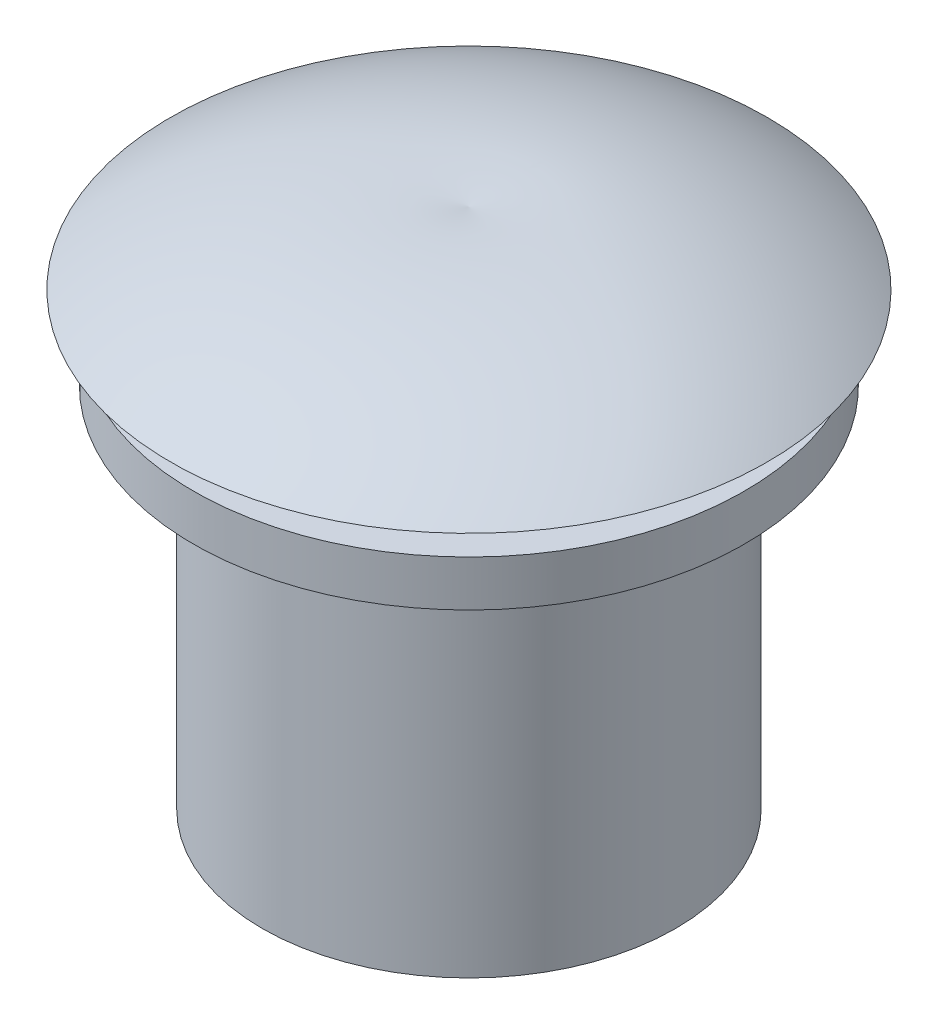
ISO-10303-21;
HEADER;
FILE_DESCRIPTION(('STEP AP214'),'2;1');
FILE_NAME('part.step','',(''),(''),'','','');
FILE_SCHEMA(('AUTOMOTIVE_DESIGN { 1 0 10303 214 1 1 1 1 }'));
ENDSEC;
DATA;
#1=APPLICATION_CONTEXT('core data for automotive mechanical design processes');
#2=APPLICATION_PROTOCOL_DEFINITION('international standard','automotive_design',2000,#1);
#3=PRODUCT_CONTEXT('',#1,'mechanical');
#4=PRODUCT('Part','Part','',(#3));
#5=PRODUCT_RELATED_PRODUCT_CATEGORY('part','',(#4));
#6=PRODUCT_DEFINITION_FORMATION('','',#4);
#7=PRODUCT_DEFINITION_CONTEXT('part definition',#1,'design');
#8=PRODUCT_DEFINITION('design','',#6,#7);
#9=PRODUCT_DEFINITION_SHAPE('','',#8);
#10=(LENGTH_UNIT() NAMED_UNIT(*) SI_UNIT(.MILLI.,.METRE.));
#11=(NAMED_UNIT(*) PLANE_ANGLE_UNIT() SI_UNIT($,.RADIAN.));
#12=(NAMED_UNIT(*) SI_UNIT($,.STERADIAN.) SOLID_ANGLE_UNIT());
#13=UNCERTAINTY_MEASURE_WITH_UNIT(LENGTH_MEASURE(1.E-05),#10,'distance_accuracy_value','');
#14=(GEOMETRIC_REPRESENTATION_CONTEXT(3) GLOBAL_UNCERTAINTY_ASSIGNED_CONTEXT((#13)) GLOBAL_UNIT_ASSIGNED_CONTEXT((#10,
#11,#12)) REPRESENTATION_CONTEXT('',''));
#15=CARTESIAN_POINT('',(0.,0.,0.));
#16=DIRECTION('',(0.,0.,1.));
#17=DIRECTION('',(1.,0.,0.));
#18=AXIS2_PLACEMENT_3D('',#15,#16,#17);
#19=CARTESIAN_POINT('',(0.,0.254030923392342,-0.150088243500463));
#20=DIRECTION('',(-1.,0.,0.));
#21=DIRECTION('',(0.,0.,-1.));
#22=AXIS2_PLACEMENT_3D('',#19,#20,#21);
#23=CIRCLE('',#22,1.19891957042545);
#24=TRIMMED_CURVE('',#23,(PARAMETER_VALUE(-1.69631188121676)),
(PARAMETER_VALUE(1.69631188121676)),.T.,.PARAMETER.);
#25=CARTESIAN_POINT('',(0.,0.254030923392342,0.));
#26=DIRECTION('',(0.,-1.,0.));
#27=AXIS1_PLACEMENT('',#25,#26);
#28=SURFACE_OF_REVOLUTION('',#24,#27);
#29=CARTESIAN_POINT('',(0.,1.44351890379067,0.));
#30=VERTEX_POINT('',#29);
#31=VERTEX_LOOP('',#30);
#32=FACE_BOUND('',#31,.T.);
#33=CARTESIAN_POINT('',(0.,1.2446,0.));
#34=DIRECTION('',(0.,-1.,0.));
#35=DIRECTION('',(0.,0.,-1.));
#36=AXIS2_PLACEMENT_3D('',#33,#34,#35);
#37=CIRCLE('',#36,0.825500000000002);
#38=CARTESIAN_POINT('',(0.,1.2446,-0.825500000000002));
#39=VERTEX_POINT('',#38);
#40=EDGE_CURVE('E11',#39,#39,#37,.T.);
#41=ORIENTED_EDGE('',*,*,#40,.F.);
#42=EDGE_LOOP('',(#41));
#43=FACE_BOUND('',#42,.T.);
#44=ADVANCED_FACE('F43',(#32,#43),#28,.T.);
#45=CARTESIAN_POINT('',(0.508000000000002,1.2446,0.));
#46=DIRECTION('',(0.,-1.,0.));
#47=DIRECTION('',(0.,0.,-1.));
#48=AXIS2_PLACEMENT_3D('',#45,#46,#47);
#49=PLANE('',#48);
#50=ORIENTED_EDGE('',*,*,#40,.T.);
#51=EDGE_LOOP('',(#50));
#52=FACE_BOUND('',#51,.T.);
#53=CARTESIAN_POINT('',(0.,1.2446,0.));
#54=DIRECTION('',(0.,-1.,0.));
#55=DIRECTION('',(0.,0.,-1.));
#56=AXIS2_PLACEMENT_3D('',#53,#54,#55);
#57=CIRCLE('',#56,0.508000000000002);
#58=CARTESIAN_POINT('',(0.,1.2446,-0.508000000000002));
#59=VERTEX_POINT('',#58);
#60=EDGE_CURVE('E50',#59,#59,#57,.T.);
#61=ORIENTED_EDGE('',*,*,#60,.F.);
#62=EDGE_LOOP('',(#61));
#63=FACE_BOUND('',#62,.T.);
#64=ADVANCED_FACE('F55',(#52,#63),#49,.T.);
#65=CARTESIAN_POINT('',(0.,0.,0.));
#66=DIRECTION('',(0.,-1.,0.));
#67=DIRECTION('',(0.,0.,-1.));
#68=AXIS2_PLACEMENT_3D('',#65,#66,#67);
#69=CYLINDRICAL_SURFACE('',#68,0.508000000000002);
#70=ORIENTED_EDGE('',*,*,#60,.T.);
#71=EDGE_LOOP('',(#70));
#72=FACE_BOUND('',#71,.T.);
#73=CARTESIAN_POINT('',(0.,1.143,0.));
#74=DIRECTION('',(0.,-1.,0.));
#75=DIRECTION('',(0.,0.,-1.));
#76=AXIS2_PLACEMENT_3D('',#73,#74,#75);
#77=CIRCLE('',#76,0.508000000000002);
#78=CARTESIAN_POINT('',(0.,1.143,-0.508000000000002));
#79=VERTEX_POINT('',#78);
#80=EDGE_CURVE('E65',#79,#79,#77,.T.);
#81=ORIENTED_EDGE('',*,*,#80,.F.);
#82=EDGE_LOOP('',(#81));
#83=FACE_BOUND('',#82,.T.);
#84=ADVANCED_FACE('F60',(#72,#83),#69,.T.);
#85=CARTESIAN_POINT('',(0.762000000000002,1.143,0.));
#86=DIRECTION('',(0.,1.,0.));
#87=DIRECTION('',(0.,0.,1.));
#88=AXIS2_PLACEMENT_3D('',#85,#86,#87);
#89=PLANE('',#88);
#90=ORIENTED_EDGE('',*,*,#80,.T.);
#91=EDGE_LOOP('',(#90));
#92=FACE_BOUND('',#91,.T.);
#93=CARTESIAN_POINT('',(0.,1.143,0.));
#94=DIRECTION('',(0.,-1.,0.));
#95=DIRECTION('',(0.,0.,-1.));
#96=AXIS2_PLACEMENT_3D('',#93,#94,#95);
#97=CIRCLE('',#96,0.762000000000002);
#98=CARTESIAN_POINT('',(0.,1.143,-0.762000000000002));
#99=VERTEX_POINT('',#98);
#100=EDGE_CURVE('E68',#99,#99,#97,.T.);
#101=ORIENTED_EDGE('',*,*,#100,.F.);
#102=EDGE_LOOP('',(#101));
#103=FACE_BOUND('',#102,.T.);
#104=ADVANCED_FACE('F137',(#92,#103),#89,.T.);
#105=CARTESIAN_POINT('',(0.,0.,0.));
#106=DIRECTION('',(0.,-1.,0.));
#107=DIRECTION('',(0.,0.,-1.));
#108=AXIS2_PLACEMENT_3D('',#105,#106,#107);
#109=CYLINDRICAL_SURFACE('',#108,0.762000000000002);
#110=ORIENTED_EDGE('',*,*,#100,.T.);
#111=EDGE_LOOP('',(#110));
#112=FACE_BOUND('',#111,.T.);
#113=CARTESIAN_POINT('',(0.,1.016,0.));
#114=DIRECTION('',(0.,-1.,0.));
#115=DIRECTION('',(0.,0.,-1.));
#116=AXIS2_PLACEMENT_3D('',#113,#114,#115);
#117=CIRCLE('',#116,0.762000000000002);
#118=CARTESIAN_POINT('',(0.,1.016,-0.762000000000002));
#119=VERTEX_POINT('',#118);
#120=EDGE_CURVE('E74',#119,#119,#117,.T.);
#121=ORIENTED_EDGE('',*,*,#120,.F.);
#122=EDGE_LOOP('',(#121));
#123=FACE_BOUND('',#122,.T.);
#124=ADVANCED_FACE('F133',(#112,#123),#109,.T.);
#125=CARTESIAN_POINT('',(0.5715,1.016,0.));
#126=DIRECTION('',(0.,-1.,0.));
#127=DIRECTION('',(0.,0.,-1.));
#128=AXIS2_PLACEMENT_3D('',#125,#126,#127);
#129=PLANE('',#128);
#130=ORIENTED_EDGE('',*,*,#120,.T.);
#131=EDGE_LOOP('',(#130));
#132=FACE_BOUND('',#131,.T.);
#133=CARTESIAN_POINT('',(0.,1.016,0.));
#134=DIRECTION('',(0.,-1.,0.));
#135=DIRECTION('',(0.,0.,-1.));
#136=AXIS2_PLACEMENT_3D('',#133,#134,#135);
#137=CIRCLE('',#136,0.5715);
#138=CARTESIAN_POINT('',(0.,1.016,-0.5715));
#139=VERTEX_POINT('',#138);
#140=EDGE_CURVE('E78',#139,#139,#137,.T.);
#141=ORIENTED_EDGE('',*,*,#140,.F.);
#142=EDGE_LOOP('',(#141));
#143=FACE_BOUND('',#142,.T.);
#144=ADVANCED_FACE('F129',(#132,#143),#129,.T.);
#145=CARTESIAN_POINT('',(0.,0.,0.));
#146=DIRECTION('',(0.,-1.,0.));
#147=DIRECTION('',(0.,0.,-1.));
#148=AXIS2_PLACEMENT_3D('',#145,#146,#147);
#149=CYLINDRICAL_SURFACE('',#148,0.5715);
#150=ORIENTED_EDGE('',*,*,#140,.T.);
#151=EDGE_LOOP('',(#150));
#152=FACE_BOUND('',#151,.T.);
#153=CARTESIAN_POINT('',(0.,0.,0.));
#154=DIRECTION('',(0.,-1.,0.));
#155=DIRECTION('',(0.,0.,-1.));
#156=AXIS2_PLACEMENT_3D('',#153,#154,#155);
#157=CIRCLE('',#156,0.5715);
#158=CARTESIAN_POINT('',(0.,0.,-0.5715));
#159=VERTEX_POINT('',#158);
#160=EDGE_CURVE('E82',#159,#159,#157,.T.);
#161=ORIENTED_EDGE('',*,*,#160,.F.);
#162=EDGE_LOOP('',(#161));
#163=FACE_BOUND('',#162,.T.);
#164=ADVANCED_FACE('F125',(#152,#163),#149,.T.);
#165=CARTESIAN_POINT('',(0.34925,0.,0.));
#166=DIRECTION('',(0.,-1.,0.));
#167=DIRECTION('',(0.,0.,-1.));
#168=AXIS2_PLACEMENT_3D('',#165,#166,#167);
#169=PLANE('',#168);
#170=ORIENTED_EDGE('',*,*,#160,.T.);
#171=EDGE_LOOP('',(#170));
#172=FACE_BOUND('',#171,.T.);
#173=CARTESIAN_POINT('',(0.,0.,0.));
#174=DIRECTION('',(0.,-1.,0.));
#175=DIRECTION('',(0.,0.,-1.));
#176=AXIS2_PLACEMENT_3D('',#173,#174,#175);
#177=CIRCLE('',#176,0.34925);
#178=CARTESIAN_POINT('',(0.,0.,-0.34925));
#179=VERTEX_POINT('',#178);
#180=EDGE_CURVE('E86',#179,#179,#177,.T.);
#181=ORIENTED_EDGE('',*,*,#180,.F.);
#182=EDGE_LOOP('',(#181));
#183=FACE_BOUND('',#182,.T.);
#184=ADVANCED_FACE('F121',(#172,#183),#169,.T.);
#185=CARTESIAN_POINT('',(0.,0.,0.));
#186=DIRECTION('',(0.,-1.,0.));
#187=DIRECTION('',(0.,0.,-1.));
#188=AXIS2_PLACEMENT_3D('',#185,#186,#187);
#189=CYLINDRICAL_SURFACE('',#188,0.34925);
#190=ORIENTED_EDGE('',*,*,#180,.T.);
#191=EDGE_LOOP('',(#190));
#192=FACE_BOUND('',#191,.T.);
#193=CARTESIAN_POINT('',(0.,0.8001,0.));
#194=DIRECTION('',(0.,-1.,0.));
#195=DIRECTION('',(0.,0.,-1.));
#196=AXIS2_PLACEMENT_3D('',#193,#194,#195);
#197=CIRCLE('',#196,0.34925);
#198=CARTESIAN_POINT('',(0.,0.8001,-0.34925));
#199=VERTEX_POINT('',#198);
#200=EDGE_CURVE('E90',#199,#199,#197,.T.);
#201=ORIENTED_EDGE('',*,*,#200,.F.);
#202=EDGE_LOOP('',(#201));
#203=FACE_BOUND('',#202,.T.);
#204=ADVANCED_FACE('F115',(#192,#203),#189,.F.);
#205=CARTESIAN_POINT('',(0.22225,0.8001,0.));
#206=DIRECTION('',(0.,-1.,0.));
#207=DIRECTION('',(0.,0.,-1.));
#208=AXIS2_PLACEMENT_3D('',#205,#206,#207);
#209=PLANE('',#208);
#210=ORIENTED_EDGE('',*,*,#200,.T.);
#211=EDGE_LOOP('',(#210));
#212=FACE_BOUND('',#211,.T.);
#213=CARTESIAN_POINT('',(0.,0.8001,0.));
#214=DIRECTION('',(0.,-1.,0.));
#215=DIRECTION('',(0.,0.,-1.));
#216=AXIS2_PLACEMENT_3D('',#213,#214,#215);
#217=CIRCLE('',#216,0.22225);
#218=CARTESIAN_POINT('',(0.,0.8001,-0.22225));
#219=VERTEX_POINT('',#218);
#220=EDGE_CURVE('E94',#219,#219,#217,.T.);
#221=ORIENTED_EDGE('',*,*,#220,.F.);
#222=EDGE_LOOP('',(#221));
#223=FACE_BOUND('',#222,.T.);
#224=ADVANCED_FACE('F107',(#212,#223),#209,.T.);
#225=CARTESIAN_POINT('',(0.,0.,0.));
#226=DIRECTION('',(0.,-1.,0.));
#227=DIRECTION('',(0.,0.,-1.));
#228=AXIS2_PLACEMENT_3D('',#225,#226,#227);
#229=CYLINDRICAL_SURFACE('',#228,0.22225);
#230=ORIENTED_EDGE('',*,*,#220,.T.);
#231=EDGE_LOOP('',(#230));
#232=FACE_BOUND('',#231,.T.);
#233=CARTESIAN_POINT('',(0.,0.,0.));
#234=DIRECTION('',(0.,-1.,0.));
#235=DIRECTION('',(0.,0.,-1.));
#236=AXIS2_PLACEMENT_3D('',#233,#234,#235);
#237=CIRCLE('',#236,0.22225);
#238=CARTESIAN_POINT('',(0.,0.,-0.22225));
#239=VERTEX_POINT('',#238);
#240=EDGE_CURVE('E98',#239,#239,#237,.T.);
#241=ORIENTED_EDGE('',*,*,#240,.F.);
#242=EDGE_LOOP('',(#241));
#243=FACE_BOUND('',#242,.T.);
#244=ADVANCED_FACE('F105',(#232,#243),#229,.T.);
#245=CARTESIAN_POINT('',(0.,0.,0.));
#246=DIRECTION('',(0.,-1.,0.));
#247=DIRECTION('',(0.,0.,-1.));
#248=AXIS2_PLACEMENT_3D('',#245,#246,#247);
#249=PLANE('',#248);
#250=ORIENTED_EDGE('',*,*,#240,.T.);
#251=EDGE_LOOP('',(#250));
#252=FACE_BOUND('',#251,.T.);
#253=ADVANCED_FACE('F103',(#252),#249,.T.);
#254=CLOSED_SHELL('',(#44,#64,#84,#104,#124,#144,#164,#184,#204,#224,#244,#253));
#255=MANIFOLD_SOLID_BREP('B2',#254);
#256=ADVANCED_BREP_SHAPE_REPRESENTATION('',(#18,#255),#14);
#257=SHAPE_DEFINITION_REPRESENTATION(#9,#256);
ENDSEC;
END-ISO-10303-21;
